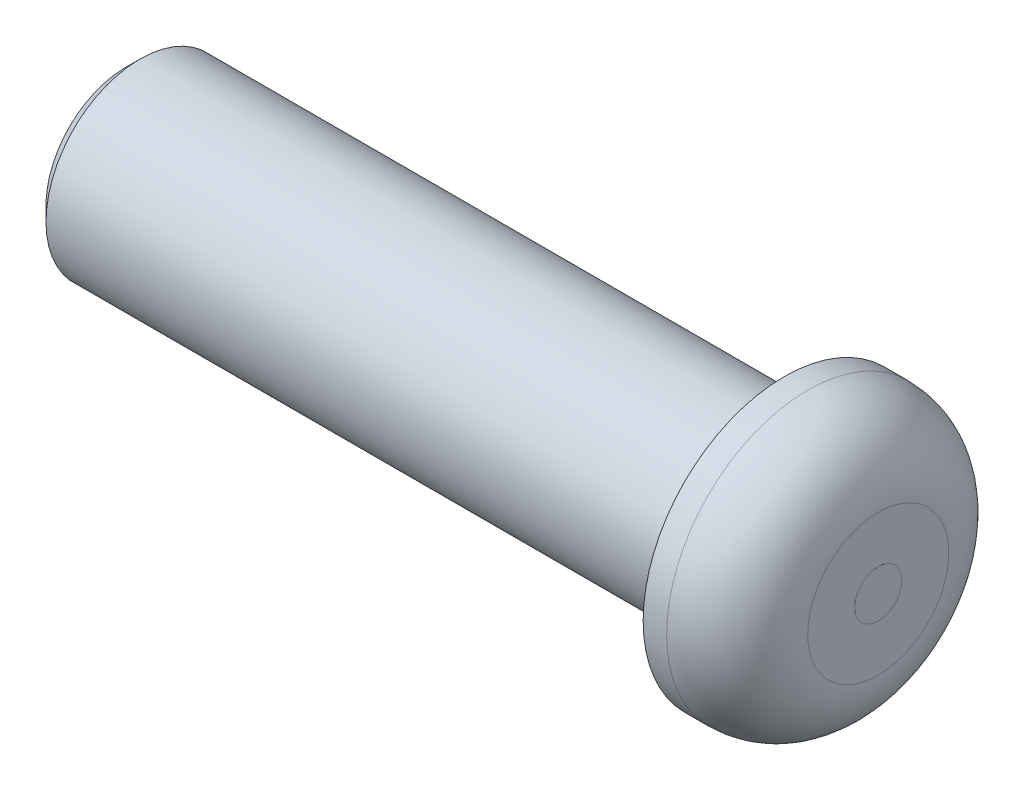
ISO-10303-21;
HEADER;
FILE_DESCRIPTION(('STEP AP214'),'2;1');
FILE_NAME('part.step','',(''),(''),'','','');
FILE_SCHEMA(('AUTOMOTIVE_DESIGN { 1 0 10303 214 1 1 1 1 }'));
ENDSEC;
DATA;
#1=APPLICATION_CONTEXT('core data for automotive mechanical design processes');
#2=APPLICATION_PROTOCOL_DEFINITION('international standard','automotive_design',2000,#1);
#3=PRODUCT_CONTEXT('',#1,'mechanical');
#4=PRODUCT('Part','Part','',(#3));
#5=PRODUCT_RELATED_PRODUCT_CATEGORY('part','',(#4));
#6=PRODUCT_DEFINITION_FORMATION('','',#4);
#7=PRODUCT_DEFINITION_CONTEXT('part definition',#1,'design');
#8=PRODUCT_DEFINITION('design','',#6,#7);
#9=PRODUCT_DEFINITION_SHAPE('','',#8);
#10=(LENGTH_UNIT() NAMED_UNIT(*) SI_UNIT(.MILLI.,.METRE.));
#11=(NAMED_UNIT(*) PLANE_ANGLE_UNIT() SI_UNIT($,.RADIAN.));
#12=(NAMED_UNIT(*) SI_UNIT($,.STERADIAN.) SOLID_ANGLE_UNIT());
#13=UNCERTAINTY_MEASURE_WITH_UNIT(LENGTH_MEASURE(1.E-05),#10,'distance_accuracy_value','');
#14=(GEOMETRIC_REPRESENTATION_CONTEXT(3) GLOBAL_UNCERTAINTY_ASSIGNED_CONTEXT((#13)) GLOBAL_UNIT_ASSIGNED_CONTEXT((#10,
#11,#12)) REPRESENTATION_CONTEXT('',''));
#15=CARTESIAN_POINT('',(0.,0.,0.));
#16=DIRECTION('',(0.,0.,1.));
#17=DIRECTION('',(1.,0.,0.));
#18=AXIS2_PLACEMENT_3D('',#15,#16,#17);
#19=CARTESIAN_POINT('',(0.,2.,0.));
#20=DIRECTION('',(1.,0.,0.));
#21=DIRECTION('',(0.,0.,-1.));
#22=AXIS2_PLACEMENT_3D('',#19,#20,#21);
#23=PLANE('',#22);
#24=CARTESIAN_POINT('',(0.,0.,0.));
#25=DIRECTION('',(1.,0.,0.));
#26=DIRECTION('',(0.,0.,-1.));
#27=AXIS2_PLACEMENT_3D('',#24,#25,#26);
#28=CIRCLE('',#27,1.7);
#29=CARTESIAN_POINT('',(0.,0.,-1.7));
#30=VERTEX_POINT('',#29);
#31=EDGE_CURVE('E41',#30,#30,#28,.F.);
#32=ORIENTED_EDGE('',*,*,#31,.T.);
#33=EDGE_LOOP('',(#32));
#34=FACE_BOUND('',#33,.T.);
#35=ADVANCED_FACE('F34',(#34),#23,.F.);
#36=CARTESIAN_POINT('',(16.0005530772267,0.,0.));
#37=DIRECTION('',(-1.,0.,0.));
#38=DIRECTION('',(0.,0.,1.));
#39=AXIS2_PLACEMENT_3D('',#36,#37,#38);
#40=PLANE('',#39);
#41=CARTESIAN_POINT('',(16.0005530772267,0.,0.));
#42=DIRECTION('',(-1.,0.,0.));
#43=DIRECTION('',(0.,0.,1.));
#44=AXIS2_PLACEMENT_3D('',#41,#42,#43);
#45=CIRCLE('',#44,0.5);
#46=CARTESIAN_POINT('',(16.0005530772267,0.,0.5));
#47=VERTEX_POINT('',#46);
#48=EDGE_CURVE('E54',#47,#47,#45,.T.);
#49=ORIENTED_EDGE('',*,*,#48,.F.);
#50=EDGE_LOOP('',(#49));
#51=FACE_BOUND('',#50,.T.);
#52=ADVANCED_FACE('F87',(#51),#40,.F.);
#53=CARTESIAN_POINT('',(0.,0.,0.));
#54=DIRECTION('',(-1.,0.,0.));
#55=DIRECTION('',(0.,0.,1.));
#56=AXIS2_PLACEMENT_3D('',#53,#54,#55);
#57=CYLINDRICAL_SURFACE('',#56,0.5);
#58=CARTESIAN_POINT('',(16.,0.,0.));
#59=DIRECTION('',(-1.,0.,0.));
#60=DIRECTION('',(0.,0.,1.));
#61=AXIS2_PLACEMENT_3D('',#58,#59,#60);
#62=CIRCLE('',#61,0.5);
#63=CARTESIAN_POINT('',(16.,0.,0.5));
#64=VERTEX_POINT('',#63);
#65=EDGE_CURVE('E57',#64,#64,#62,.T.);
#66=ORIENTED_EDGE('',*,*,#65,.F.);
#67=EDGE_LOOP('',(#66));
#68=FACE_BOUND('',#67,.T.);
#69=ORIENTED_EDGE('',*,*,#48,.T.);
#70=EDGE_LOOP('',(#69));
#71=FACE_BOUND('',#70,.T.);
#72=ADVANCED_FACE('F83',(#68,#71),#57,.T.);
#73=CARTESIAN_POINT('',(16.,0.5,0.));
#74=DIRECTION('',(-1.,0.,0.));
#75=DIRECTION('',(0.,0.,1.));
#76=AXIS2_PLACEMENT_3D('',#73,#74,#75);
#77=PLANE('',#76);
#78=CARTESIAN_POINT('',(16.,0.,0.));
#79=DIRECTION('',(-1.,0.,0.));
#80=DIRECTION('',(0.,0.,1.));
#81=AXIS2_PLACEMENT_3D('',#78,#79,#80);
#82=CIRCLE('',#81,1.5);
#83=CARTESIAN_POINT('',(16.,0.,1.5));
#84=VERTEX_POINT('',#83);
#85=EDGE_CURVE('E45',#84,#84,#82,.F.);
#86=ORIENTED_EDGE('',*,*,#85,.T.);
#87=EDGE_LOOP('',(#86));
#88=FACE_BOUND('',#87,.T.);
#89=ORIENTED_EDGE('',*,*,#65,.T.);
#90=EDGE_LOOP('',(#89));
#91=FACE_BOUND('',#90,.T.);
#92=ADVANCED_FACE('F77',(#88,#91),#77,.F.);
#93=CARTESIAN_POINT('',(0.,0.,0.));
#94=DIRECTION('',(-1.,0.,0.));
#95=DIRECTION('',(0.,0.,1.));
#96=AXIS2_PLACEMENT_3D('',#93,#94,#95);
#97=CYLINDRICAL_SURFACE('',#96,3.);
#98=CARTESIAN_POINT('',(14.5,0.,0.));
#99=DIRECTION('',(-1.,0.,0.));
#100=DIRECTION('',(0.,0.,1.));
#101=AXIS2_PLACEMENT_3D('',#98,#99,#100);
#102=CIRCLE('',#101,3.);
#103=CARTESIAN_POINT('',(14.5,0.,3.));
#104=VERTEX_POINT('',#103);
#105=EDGE_CURVE('E49',#104,#104,#102,.T.);
#106=ORIENTED_EDGE('',*,*,#105,.T.);
#107=EDGE_LOOP('',(#106));
#108=FACE_BOUND('',#107,.T.);
#109=CARTESIAN_POINT('',(14.,0.,0.));
#110=DIRECTION('',(-1.,0.,0.));
#111=DIRECTION('',(0.,0.,1.));
#112=AXIS2_PLACEMENT_3D('',#109,#110,#111);
#113=CIRCLE('',#112,3.);
#114=CARTESIAN_POINT('',(14.,0.,3.));
#115=VERTEX_POINT('',#114);
#116=EDGE_CURVE('E60',#115,#115,#113,.T.);
#117=ORIENTED_EDGE('',*,*,#116,.F.);
#118=EDGE_LOOP('',(#117));
#119=FACE_BOUND('',#118,.T.);
#120=ADVANCED_FACE('F72',(#108,#119),#97,.T.);
#121=CARTESIAN_POINT('',(14.,3.,0.));
#122=DIRECTION('',(1.,0.,0.));
#123=DIRECTION('',(0.,0.,-1.));
#124=AXIS2_PLACEMENT_3D('',#121,#122,#123);
#125=PLANE('',#124);
#126=CARTESIAN_POINT('',(14.,0.,0.));
#127=DIRECTION('',(-1.,0.,0.));
#128=DIRECTION('',(0.,0.,1.));
#129=AXIS2_PLACEMENT_3D('',#126,#127,#128);
#130=CIRCLE('',#129,2.);
#131=CARTESIAN_POINT('',(14.,0.,2.));
#132=VERTEX_POINT('',#131);
#133=EDGE_CURVE('E63',#132,#132,#130,.T.);
#134=ORIENTED_EDGE('',*,*,#133,.F.);
#135=EDGE_LOOP('',(#134));
#136=FACE_BOUND('',#135,.T.);
#137=ORIENTED_EDGE('',*,*,#116,.T.);
#138=EDGE_LOOP('',(#137));
#139=FACE_BOUND('',#138,.T.);
#140=ADVANCED_FACE('F69',(#136,#139),#125,.F.);
#141=CARTESIAN_POINT('',(0.,0.,0.));
#142=DIRECTION('',(-1.,0.,0.));
#143=DIRECTION('',(0.,0.,1.));
#144=AXIS2_PLACEMENT_3D('',#141,#142,#143);
#145=CYLINDRICAL_SURFACE('',#144,2.);
#146=CARTESIAN_POINT('',(0.300000000000002,0.,0.));
#147=DIRECTION('',(1.,0.,0.));
#148=DIRECTION('',(0.,0.,-1.));
#149=AXIS2_PLACEMENT_3D('',#146,#147,#148);
#150=CIRCLE('',#149,2.);
#151=CARTESIAN_POINT('',(0.300000000000002,0.,-2.));
#152=VERTEX_POINT('',#151);
#153=EDGE_CURVE('E10',#152,#152,#150,.T.);
#154=ORIENTED_EDGE('',*,*,#153,.T.);
#155=EDGE_LOOP('',(#154));
#156=FACE_BOUND('',#155,.T.);
#157=ORIENTED_EDGE('',*,*,#133,.T.);
#158=EDGE_LOOP('',(#157));
#159=FACE_BOUND('',#158,.T.);
#160=ADVANCED_FACE('F67',(#156,#159),#145,.T.);
#161=CARTESIAN_POINT('',(14.5,0.,0.));
#162=DIRECTION('',(-1.,0.,0.));
#163=DIRECTION('',(0.,0.,1.));
#164=AXIS2_PLACEMENT_3D('',#161,#162,#163);
#165=DEGENERATE_TOROIDAL_SURFACE('',#164,1.5,1.5,.T.);
#166=ORIENTED_EDGE('',*,*,#85,.F.);
#167=EDGE_LOOP('',(#166));
#168=FACE_BOUND('',#167,.T.);
#169=ORIENTED_EDGE('',*,*,#105,.F.);
#170=EDGE_LOOP('',(#169));
#171=FACE_BOUND('',#170,.T.);
#172=ADVANCED_FACE('F97',(#168,#171),#165,.T.);
#173=CARTESIAN_POINT('',(0.,0.,0.));
#174=DIRECTION('',(1.,0.,0.));
#175=DIRECTION('',(0.,0.,-1.));
#176=AXIS2_PLACEMENT_3D('',#173,#174,#175);
#177=CONICAL_SURFACE('',#176,1.7,0.785398163397447);
#178=ORIENTED_EDGE('',*,*,#153,.F.);
#179=EDGE_LOOP('',(#178));
#180=FACE_BOUND('',#179,.T.);
#181=ORIENTED_EDGE('',*,*,#31,.F.);
#182=EDGE_LOOP('',(#181));
#183=FACE_BOUND('',#182,.T.);
#184=ADVANCED_FACE('F36',(#180,#183),#177,.T.);
#185=CLOSED_SHELL('',(#35,#52,#72,#92,#120,#140,#160,#172,#184));
#186=MANIFOLD_SOLID_BREP('B2',#185);
#187=ADVANCED_BREP_SHAPE_REPRESENTATION('',(#18,#186),#14);
#188=SHAPE_DEFINITION_REPRESENTATION(#9,#187);
ENDSEC;
END-ISO-10303-21;
